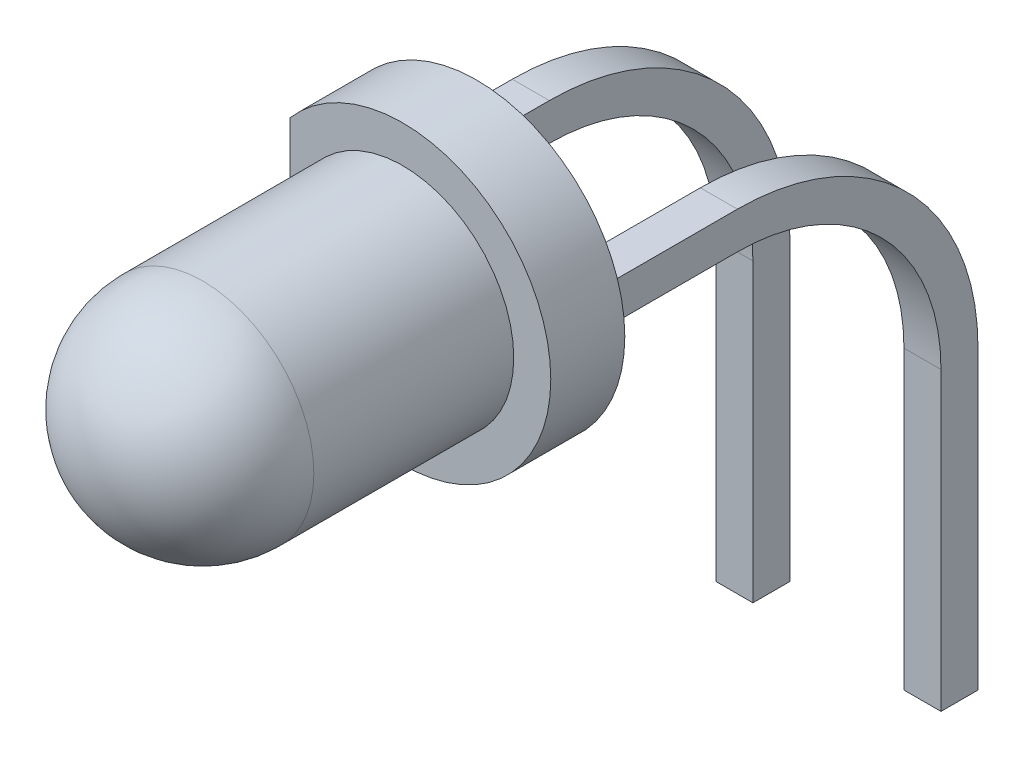
ISO-10303-21;
HEADER;
FILE_DESCRIPTION(('STEP AP214'),'2;1');
FILE_NAME('part.step','',(''),(''),'','','');
FILE_SCHEMA(('AUTOMOTIVE_DESIGN { 1 0 10303 214 1 1 1 1 }'));
ENDSEC;
DATA;
#1=APPLICATION_CONTEXT('core data for automotive mechanical design processes');
#2=APPLICATION_PROTOCOL_DEFINITION('international standard','automotive_design',2000,#1);
#3=PRODUCT_CONTEXT('',#1,'mechanical');
#4=PRODUCT('Part','Part','',(#3));
#5=PRODUCT_RELATED_PRODUCT_CATEGORY('part','',(#4));
#6=PRODUCT_DEFINITION_FORMATION('','',#4);
#7=PRODUCT_DEFINITION_CONTEXT('part definition',#1,'design');
#8=PRODUCT_DEFINITION('design','',#6,#7);
#9=PRODUCT_DEFINITION_SHAPE('','',#8);
#10=(LENGTH_UNIT() NAMED_UNIT(*) SI_UNIT(.MILLI.,.METRE.));
#11=(NAMED_UNIT(*) PLANE_ANGLE_UNIT() SI_UNIT($,.RADIAN.));
#12=(NAMED_UNIT(*) SI_UNIT($,.STERADIAN.) SOLID_ANGLE_UNIT());
#13=UNCERTAINTY_MEASURE_WITH_UNIT(LENGTH_MEASURE(1.E-05),#10,'distance_accuracy_value','');
#14=(GEOMETRIC_REPRESENTATION_CONTEXT(3) GLOBAL_UNCERTAINTY_ASSIGNED_CONTEXT((#13)) GLOBAL_UNIT_ASSIGNED_CONTEXT((#10,
#11,#12)) REPRESENTATION_CONTEXT('',''));
#15=CARTESIAN_POINT('',(0.,0.,0.));
#16=DIRECTION('',(0.,0.,1.));
#17=DIRECTION('',(1.,0.,0.));
#18=AXIS2_PLACEMENT_3D('',#15,#16,#17);
#19=CARTESIAN_POINT('',(-1.52000000000002,0.,-0.249999999999991));
#20=DIRECTION('',(0.,0.,1.));
#21=DIRECTION('',(1.,0.,0.));
#22=AXIS2_PLACEMENT_3D('',#19,#20,#21);
#23=PLANE('',#22);
#24=DIRECTION('',(-1.,0.,0.));
#25=VECTOR('',#24,1.);
#26=CARTESIAN_POINT('',(-1.52000000000002,0.,-0.249999999999991));
#27=LINE('',#26,#25);
#28=CARTESIAN_POINT('',(-1.02000000000002,0.,-0.249999999999994));
#29=VERTEX_POINT('',#28);
#30=CARTESIAN_POINT('',(-1.52000000000002,0.,-0.249999999999991));
#31=VERTEX_POINT('',#30);
#32=EDGE_CURVE('E121',#29,#31,#27,.T.);
#33=ORIENTED_EDGE('',*,*,#32,.F.);
#34=DIRECTION('',(0.,-1.,0.));
#35=VECTOR('',#34,1.);
#36=CARTESIAN_POINT('',(-1.02000000000002,0.,-0.249999999999994));
#37=LINE('',#36,#35);
#38=CARTESIAN_POINT('',(-1.02000000000002,-4.,-0.249999999999995));
#39=VERTEX_POINT('',#38);
#40=EDGE_CURVE('E51',#29,#39,#37,.T.);
#41=ORIENTED_EDGE('',*,*,#40,.T.);
#42=DIRECTION('',(-1.,0.,0.));
#43=VECTOR('',#42,1.);
#44=CARTESIAN_POINT('',(-1.52000000000002,-4.,-0.249999999999991));
#45=LINE('',#44,#43);
#46=CARTESIAN_POINT('',(-1.52000000000002,-4.,-0.249999999999991));
#47=VERTEX_POINT('',#46);
#48=EDGE_CURVE('E58',#39,#47,#45,.T.);
#49=ORIENTED_EDGE('',*,*,#48,.T.);
#50=DIRECTION('',(0.,-1.,0.));
#51=VECTOR('',#50,1.);
#52=CARTESIAN_POINT('',(-1.52000000000002,0.,-0.249999999999991));
#53=LINE('',#52,#51);
#54=EDGE_CURVE('E12',#31,#47,#53,.T.);
#55=ORIENTED_EDGE('',*,*,#54,.F.);
#56=EDGE_LOOP('',(#33,#41,#49,#55));
#57=FACE_BOUND('',#56,.T.);
#58=ADVANCED_FACE('F44',(#57),#23,.F.);
#59=CARTESIAN_POINT('',(-1.52000000000002,0.,0.250000000000009));
#60=DIRECTION('',(0.,0.,-1.));
#61=DIRECTION('',(-1.,0.,0.));
#62=AXIS2_PLACEMENT_3D('',#59,#60,#61);
#63=PLANE('',#62);
#64=DIRECTION('',(1.,0.,0.));
#65=VECTOR('',#64,1.);
#66=CARTESIAN_POINT('',(-1.52000000000002,0.,0.250000000000009));
#67=LINE('',#66,#65);
#68=CARTESIAN_POINT('',(-1.52000000000002,0.,0.250000000000009));
#69=VERTEX_POINT('',#68);
#70=CARTESIAN_POINT('',(-1.02000000000002,0.,0.250000000000006));
#71=VERTEX_POINT('',#70);
#72=EDGE_CURVE('E144',#69,#71,#67,.T.);
#73=ORIENTED_EDGE('',*,*,#72,.F.);
#74=DIRECTION('',(0.,-1.,0.));
#75=VECTOR('',#74,1.);
#76=CARTESIAN_POINT('',(-1.52000000000002,0.,0.250000000000009));
#77=LINE('',#76,#75);
#78=CARTESIAN_POINT('',(-1.52000000000002,-4.,0.250000000000009));
#79=VERTEX_POINT('',#78);
#80=EDGE_CURVE('E116',#69,#79,#77,.T.);
#81=ORIENTED_EDGE('',*,*,#80,.T.);
#82=DIRECTION('',(1.,0.,0.));
#83=VECTOR('',#82,1.);
#84=CARTESIAN_POINT('',(-1.52000000000002,-4.,0.250000000000009));
#85=LINE('',#84,#83);
#86=CARTESIAN_POINT('',(-1.02000000000002,-4.,0.250000000000005));
#87=VERTEX_POINT('',#86);
#88=EDGE_CURVE('E158',#79,#87,#85,.T.);
#89=ORIENTED_EDGE('',*,*,#88,.T.);
#90=DIRECTION('',(0.,-1.,0.));
#91=VECTOR('',#90,1.);
#92=CARTESIAN_POINT('',(-1.02000000000002,0.,0.250000000000006));
#93=LINE('',#92,#91);
#94=EDGE_CURVE('E163',#71,#87,#93,.T.);
#95=ORIENTED_EDGE('',*,*,#94,.F.);
#96=EDGE_LOOP('',(#73,#81,#89,#95));
#97=FACE_BOUND('',#96,.T.);
#98=ADVANCED_FACE('F190',(#97),#63,.F.);
#99=CARTESIAN_POINT('',(0.,0.,3.));
#100=DIRECTION('',(-1.,0.,0.));
#101=DIRECTION('',(0.,0.,1.));
#102=AXIS2_PLACEMENT_3D('',#99,#100,#101);
#103=CYLINDRICAL_SURFACE('',#102,3.24999999999999);
#104=DIRECTION('',(-1.,0.,0.));
#105=VECTOR('',#104,1.);
#106=CARTESIAN_POINT('',(-1.52000000000002,3.24999999999999,3.));
#107=LINE('',#106,#105);
#108=CARTESIAN_POINT('',(-1.02000000000002,3.24999999999999,3.));
#109=VERTEX_POINT('',#108);
#110=CARTESIAN_POINT('',(-1.52000000000002,3.24999999999999,3.));
#111=VERTEX_POINT('',#110);
#112=EDGE_CURVE('E129',#109,#111,#107,.T.);
#113=ORIENTED_EDGE('',*,*,#112,.F.);
#114=CARTESIAN_POINT('',(-1.02000000000002,0.,3.));
#115=DIRECTION('',(-1.,0.,0.));
#116=DIRECTION('',(0.,0.,1.));
#117=AXIS2_PLACEMENT_3D('',#114,#115,#116);
#118=CIRCLE('',#117,3.24999999999999);
#119=EDGE_CURVE('E150',#109,#29,#118,.T.);
#120=ORIENTED_EDGE('',*,*,#119,.T.);
#121=ORIENTED_EDGE('',*,*,#32,.T.);
#122=CARTESIAN_POINT('',(-1.52000000000002,0.,3.));
#123=DIRECTION('',(-1.,0.,0.));
#124=DIRECTION('',(0.,0.,1.));
#125=AXIS2_PLACEMENT_3D('',#122,#123,#124);
#126=CIRCLE('',#125,3.24999999999999);
#127=EDGE_CURVE('E153',#111,#31,#126,.T.);
#128=ORIENTED_EDGE('',*,*,#127,.F.);
#129=EDGE_LOOP('',(#113,#120,#121,#128));
#130=FACE_BOUND('',#129,.T.);
#131=ADVANCED_FACE('F171',(#130),#103,.T.);
#132=CARTESIAN_POINT('',(0.,0.,3.));
#133=DIRECTION('',(-1.,0.,0.));
#134=DIRECTION('',(0.,0.,1.));
#135=AXIS2_PLACEMENT_3D('',#132,#133,#134);
#136=CYLINDRICAL_SURFACE('',#135,2.74999999999999);
#137=DIRECTION('',(1.,0.,0.));
#138=VECTOR('',#137,1.);
#139=CARTESIAN_POINT('',(-1.52000000000002,2.74999999999999,3.));
#140=LINE('',#139,#138);
#141=CARTESIAN_POINT('',(-1.52000000000002,2.74999999999999,3.));
#142=VERTEX_POINT('',#141);
#143=CARTESIAN_POINT('',(-1.02000000000002,2.74999999999999,3.));
#144=VERTEX_POINT('',#143);
#145=EDGE_CURVE('E124',#142,#144,#140,.T.);
#146=ORIENTED_EDGE('',*,*,#145,.F.);
#147=CARTESIAN_POINT('',(-1.52000000000002,0.,3.));
#148=DIRECTION('',(-1.,0.,0.));
#149=DIRECTION('',(0.,0.,1.));
#150=AXIS2_PLACEMENT_3D('',#147,#148,#149);
#151=CIRCLE('',#150,2.74999999999999);
#152=EDGE_CURVE('E108',#142,#69,#151,.T.);
#153=ORIENTED_EDGE('',*,*,#152,.T.);
#154=ORIENTED_EDGE('',*,*,#72,.T.);
#155=CARTESIAN_POINT('',(-1.02000000000002,0.,3.));
#156=DIRECTION('',(-1.,0.,0.));
#157=DIRECTION('',(0.,0.,1.));
#158=AXIS2_PLACEMENT_3D('',#155,#156,#157);
#159=CIRCLE('',#158,2.74999999999999);
#160=EDGE_CURVE('E120',#144,#71,#159,.T.);
#161=ORIENTED_EDGE('',*,*,#160,.F.);
#162=EDGE_LOOP('',(#146,#153,#154,#161));
#163=FACE_BOUND('',#162,.T.);
#164=ADVANCED_FACE('F125',(#163),#136,.F.);
#165=CARTESIAN_POINT('',(-1.52000000000002,2.74999999999999,3.));
#166=DIRECTION('',(-1.,0.,0.));
#167=DIRECTION('',(0.,-1.,0.));
#168=AXIS2_PLACEMENT_3D('',#165,#166,#167);
#169=PLANE('',#168);
#170=DIRECTION('',(0.,-1.,0.));
#171=VECTOR('',#170,1.);
#172=CARTESIAN_POINT('',(-1.52000000000002,2.74999999999999,5.));
#173=LINE('',#172,#171);
#174=CARTESIAN_POINT('',(-1.52000000000002,3.24999999999999,5.));
#175=VERTEX_POINT('',#174);
#176=CARTESIAN_POINT('',(-1.52000000000002,2.74999999999999,5.));
#177=VERTEX_POINT('',#176);
#178=EDGE_CURVE('E183',#175,#177,#173,.T.);
#179=ORIENTED_EDGE('',*,*,#178,.F.);
#180=DIRECTION('',(0.,0.,1.));
#181=VECTOR('',#180,1.);
#182=CARTESIAN_POINT('',(-1.52000000000002,3.24999999999999,3.));
#183=LINE('',#182,#181);
#184=EDGE_CURVE('E146',#111,#175,#183,.T.);
#185=ORIENTED_EDGE('',*,*,#184,.F.);
#186=ORIENTED_EDGE('',*,*,#127,.T.);
#187=ORIENTED_EDGE('',*,*,#54,.T.);
#188=DIRECTION('',(0.,0.,1.));
#189=VECTOR('',#188,1.);
#190=CARTESIAN_POINT('',(-1.52000000000002,-4.,0.250000000000009));
#191=LINE('',#190,#189);
#192=EDGE_CURVE('E156',#47,#79,#191,.T.);
#193=ORIENTED_EDGE('',*,*,#192,.T.);
#194=ORIENTED_EDGE('',*,*,#80,.F.);
#195=ORIENTED_EDGE('',*,*,#152,.F.);
#196=DIRECTION('',(0.,0.,1.));
#197=VECTOR('',#196,1.);
#198=CARTESIAN_POINT('',(-1.52000000000002,2.74999999999999,3.));
#199=LINE('',#198,#197);
#200=EDGE_CURVE('E113',#142,#177,#199,.T.);
#201=ORIENTED_EDGE('',*,*,#200,.T.);
#202=EDGE_LOOP('',(#179,#185,#186,#187,#193,#194,#195,#201));
#203=FACE_BOUND('',#202,.T.);
#204=ADVANCED_FACE('F111',(#203),#169,.T.);
#205=CARTESIAN_POINT('',(-1.52000000000002,3.24999999999999,3.));
#206=DIRECTION('',(0.,1.,0.));
#207=DIRECTION('',(-1.,0.,0.));
#208=AXIS2_PLACEMENT_3D('',#205,#206,#207);
#209=PLANE('',#208);
#210=DIRECTION('',(-1.,0.,0.));
#211=VECTOR('',#210,1.);
#212=CARTESIAN_POINT('',(-1.52000000000002,3.24999999999999,5.));
#213=LINE('',#212,#211);
#214=CARTESIAN_POINT('',(-1.02000000000002,3.24999999999999,5.));
#215=VERTEX_POINT('',#214);
#216=EDGE_CURVE('E130',#215,#175,#213,.T.);
#217=ORIENTED_EDGE('',*,*,#216,.F.);
#218=DIRECTION('',(0.,0.,1.));
#219=VECTOR('',#218,1.);
#220=CARTESIAN_POINT('',(-1.02000000000002,3.24999999999999,3.));
#221=LINE('',#220,#219);
#222=EDGE_CURVE('E138',#109,#215,#221,.T.);
#223=ORIENTED_EDGE('',*,*,#222,.F.);
#224=ORIENTED_EDGE('',*,*,#112,.T.);
#225=ORIENTED_EDGE('',*,*,#184,.T.);
#226=EDGE_LOOP('',(#217,#223,#224,#225));
#227=FACE_BOUND('',#226,.T.);
#228=ADVANCED_FACE('F175',(#227),#209,.T.);
#229=CARTESIAN_POINT('',(-1.02000000000002,2.74999999999999,3.));
#230=DIRECTION('',(1.,0.,0.));
#231=DIRECTION('',(0.,1.,0.));
#232=AXIS2_PLACEMENT_3D('',#229,#230,#231);
#233=PLANE('',#232);
#234=DIRECTION('',(0.,1.,0.));
#235=VECTOR('',#234,1.);
#236=CARTESIAN_POINT('',(-1.02000000000002,2.74999999999999,5.));
#237=LINE('',#236,#235);
#238=CARTESIAN_POINT('',(-1.02000000000002,2.74999999999999,5.));
#239=VERTEX_POINT('',#238);
#240=EDGE_CURVE('E180',#239,#215,#237,.T.);
#241=ORIENTED_EDGE('',*,*,#240,.F.);
#242=DIRECTION('',(0.,0.,1.));
#243=VECTOR('',#242,1.);
#244=CARTESIAN_POINT('',(-1.02000000000002,2.74999999999999,3.));
#245=LINE('',#244,#243);
#246=EDGE_CURVE('E136',#144,#239,#245,.T.);
#247=ORIENTED_EDGE('',*,*,#246,.F.);
#248=ORIENTED_EDGE('',*,*,#160,.T.);
#249=ORIENTED_EDGE('',*,*,#94,.T.);
#250=DIRECTION('',(0.,0.,-1.));
#251=VECTOR('',#250,1.);
#252=CARTESIAN_POINT('',(-1.02000000000002,-4.,0.250000000000005));
#253=LINE('',#252,#251);
#254=EDGE_CURVE('E66',#87,#39,#253,.T.);
#255=ORIENTED_EDGE('',*,*,#254,.T.);
#256=ORIENTED_EDGE('',*,*,#40,.F.);
#257=ORIENTED_EDGE('',*,*,#119,.F.);
#258=ORIENTED_EDGE('',*,*,#222,.T.);
#259=EDGE_LOOP('',(#241,#247,#248,#249,#255,#256,#257,#258));
#260=FACE_BOUND('',#259,.T.);
#261=ADVANCED_FACE('F166',(#260),#233,.T.);
#262=CARTESIAN_POINT('',(-1.52000000000002,2.74999999999999,3.));
#263=DIRECTION('',(0.,-1.,0.));
#264=DIRECTION('',(1.,0.,0.));
#265=AXIS2_PLACEMENT_3D('',#262,#263,#264);
#266=PLANE('',#265);
#267=DIRECTION('',(1.,0.,0.));
#268=VECTOR('',#267,1.);
#269=CARTESIAN_POINT('',(-1.52000000000002,2.74999999999999,5.));
#270=LINE('',#269,#268);
#271=EDGE_CURVE('E134',#177,#239,#270,.T.);
#272=ORIENTED_EDGE('',*,*,#271,.F.);
#273=ORIENTED_EDGE('',*,*,#200,.F.);
#274=ORIENTED_EDGE('',*,*,#145,.T.);
#275=ORIENTED_EDGE('',*,*,#246,.T.);
#276=EDGE_LOOP('',(#272,#273,#274,#275));
#277=FACE_BOUND('',#276,.T.);
#278=ADVANCED_FACE('F132',(#277),#266,.T.);
#279=CARTESIAN_POINT('',(-1.52000000000002,-4.,-0.249999999999991));
#280=DIRECTION('',(0.,-1.,0.));
#281=DIRECTION('',(-1.,0.,0.));
#282=AXIS2_PLACEMENT_3D('',#279,#280,#281);
#283=PLANE('',#282);
#284=ORIENTED_EDGE('',*,*,#192,.F.);
#285=ORIENTED_EDGE('',*,*,#48,.F.);
#286=ORIENTED_EDGE('',*,*,#254,.F.);
#287=ORIENTED_EDGE('',*,*,#88,.F.);
#288=EDGE_LOOP('',(#284,#285,#286,#287));
#289=FACE_BOUND('',#288,.T.);
#290=ADVANCED_FACE('F188',(#289),#283,.T.);
#291=CARTESIAN_POINT('',(-1.52000000000002,3.24999999999999,5.));
#292=DIRECTION('',(0.,0.,-1.));
#293=DIRECTION('',(-1.,0.,0.));
#294=AXIS2_PLACEMENT_3D('',#291,#292,#293);
#295=PLANE('',#294);
#296=ORIENTED_EDGE('',*,*,#178,.T.);
#297=ORIENTED_EDGE('',*,*,#271,.T.);
#298=ORIENTED_EDGE('',*,*,#240,.T.);
#299=ORIENTED_EDGE('',*,*,#216,.T.);
#300=EDGE_LOOP('',(#296,#297,#298,#299));
#301=FACE_BOUND('',#300,.T.);
#302=ADVANCED_FACE('F185',(#301),#295,.F.);
#303=CLOSED_SHELL('',(#58,#98,#131,#164,#204,#228,#261,#278,#290,#302));
#304=MANIFOLD_SOLID_BREP('B2',#303);
#305=CARTESIAN_POINT('',(1.52,0.,-0.250000000000001));
#306=DIRECTION('',(0.,0.,1.));
#307=DIRECTION('',(0.,-1.,0.));
#308=AXIS2_PLACEMENT_3D('',#305,#306,#307);
#309=PLANE('',#308);
#310=DIRECTION('',(-1.,0.,0.));
#311=VECTOR('',#310,1.);
#312=CARTESIAN_POINT('',(1.52,0.,-0.250000000000001));
#313=LINE('',#312,#311);
#314=CARTESIAN_POINT('',(1.52,0.,-0.250000000000001));
#315=VERTEX_POINT('',#314);
#316=CARTESIAN_POINT('',(1.02,0.,-0.250000000000001));
#317=VERTEX_POINT('',#316);
#318=EDGE_CURVE('E370',#315,#317,#313,.T.);
#319=ORIENTED_EDGE('',*,*,#318,.F.);
#320=DIRECTION('',(0.,-1.,0.));
#321=VECTOR('',#320,1.);
#322=CARTESIAN_POINT('',(1.52,0.,-0.250000000000001));
#323=LINE('',#322,#321);
#324=CARTESIAN_POINT('',(1.52,-4.,-0.250000000000002));
#325=VERTEX_POINT('',#324);
#326=EDGE_CURVE('E300',#315,#325,#323,.T.);
#327=ORIENTED_EDGE('',*,*,#326,.T.);
#328=DIRECTION('',(-1.,0.,0.));
#329=VECTOR('',#328,1.);
#330=CARTESIAN_POINT('',(1.52,-4.,-0.250000000000002));
#331=LINE('',#330,#329);
#332=CARTESIAN_POINT('',(1.02,-4.,-0.250000000000002));
#333=VERTEX_POINT('',#332);
#334=EDGE_CURVE('E307',#325,#333,#331,.T.);
#335=ORIENTED_EDGE('',*,*,#334,.T.);
#336=DIRECTION('',(0.,-1.,0.));
#337=VECTOR('',#336,1.);
#338=CARTESIAN_POINT('',(1.02,0.,-0.250000000000001));
#339=LINE('',#338,#337);
#340=EDGE_CURVE('E42',#317,#333,#339,.T.);
#341=ORIENTED_EDGE('',*,*,#340,.F.);
#342=EDGE_LOOP('',(#319,#327,#335,#341));
#343=FACE_BOUND('',#342,.T.);
#344=ADVANCED_FACE('F293',(#343),#309,.F.);
#345=CARTESIAN_POINT('',(1.52,0.,0.249999999999999));
#346=DIRECTION('',(0.,0.,-1.));
#347=DIRECTION('',(0.,1.,0.));
#348=AXIS2_PLACEMENT_3D('',#345,#346,#347);
#349=PLANE('',#348);
#350=DIRECTION('',(1.,0.,0.));
#351=VECTOR('',#350,1.);
#352=CARTESIAN_POINT('',(1.52,0.,0.249999999999999));
#353=LINE('',#352,#351);
#354=CARTESIAN_POINT('',(1.02,0.,0.249999999999999));
#355=VERTEX_POINT('',#354);
#356=CARTESIAN_POINT('',(1.52,0.,0.249999999999999));
#357=VERTEX_POINT('',#356);
#358=EDGE_CURVE('E393',#355,#357,#353,.T.);
#359=ORIENTED_EDGE('',*,*,#358,.F.);
#360=DIRECTION('',(0.,-1.,0.));
#361=VECTOR('',#360,1.);
#362=CARTESIAN_POINT('',(1.02,0.,0.249999999999999));
#363=LINE('',#362,#361);
#364=CARTESIAN_POINT('',(1.02,-4.,0.249999999999998));
#365=VERTEX_POINT('',#364);
#366=EDGE_CURVE('E365',#355,#365,#363,.T.);
#367=ORIENTED_EDGE('',*,*,#366,.T.);
#368=DIRECTION('',(1.,0.,0.));
#369=VECTOR('',#368,1.);
#370=CARTESIAN_POINT('',(1.52,-4.,0.249999999999998));
#371=LINE('',#370,#369);
#372=CARTESIAN_POINT('',(1.52,-4.,0.249999999999998));
#373=VERTEX_POINT('',#372);
#374=EDGE_CURVE('E407',#365,#373,#371,.T.);
#375=ORIENTED_EDGE('',*,*,#374,.T.);
#376=DIRECTION('',(0.,-1.,0.));
#377=VECTOR('',#376,1.);
#378=CARTESIAN_POINT('',(1.52,0.,0.249999999999999));
#379=LINE('',#378,#377);
#380=EDGE_CURVE('E412',#357,#373,#379,.T.);
#381=ORIENTED_EDGE('',*,*,#380,.F.);
#382=EDGE_LOOP('',(#359,#367,#375,#381));
#383=FACE_BOUND('',#382,.T.);
#384=ADVANCED_FACE('F439',(#383),#349,.F.);
#385=CARTESIAN_POINT('',(0.,0.,3.));
#386=DIRECTION('',(-1.,0.,0.));
#387=DIRECTION('',(0.,0.,1.));
#388=AXIS2_PLACEMENT_3D('',#385,#386,#387);
#389=CYLINDRICAL_SURFACE('',#388,3.25);
#390=DIRECTION('',(-1.,0.,0.));
#391=VECTOR('',#390,1.);
#392=CARTESIAN_POINT('',(1.52,3.25,3.));
#393=LINE('',#392,#391);
#394=CARTESIAN_POINT('',(1.52,3.25,3.));
#395=VERTEX_POINT('',#394);
#396=CARTESIAN_POINT('',(1.02,3.25,3.));
#397=VERTEX_POINT('',#396);
#398=EDGE_CURVE('E378',#395,#397,#393,.T.);
#399=ORIENTED_EDGE('',*,*,#398,.F.);
#400=CARTESIAN_POINT('',(1.52,0.,3.));
#401=DIRECTION('',(-1.,0.,0.));
#402=DIRECTION('',(0.,0.,1.));
#403=AXIS2_PLACEMENT_3D('',#400,#401,#402);
#404=CIRCLE('',#403,3.25);
#405=EDGE_CURVE('E399',#395,#315,#404,.T.);
#406=ORIENTED_EDGE('',*,*,#405,.T.);
#407=ORIENTED_EDGE('',*,*,#318,.T.);
#408=CARTESIAN_POINT('',(1.02,0.,3.));
#409=DIRECTION('',(-1.,0.,0.));
#410=DIRECTION('',(0.,0.,1.));
#411=AXIS2_PLACEMENT_3D('',#408,#409,#410);
#412=CIRCLE('',#411,3.25);
#413=EDGE_CURVE('E402',#397,#317,#412,.T.);
#414=ORIENTED_EDGE('',*,*,#413,.F.);
#415=EDGE_LOOP('',(#399,#406,#407,#414));
#416=FACE_BOUND('',#415,.T.);
#417=ADVANCED_FACE('F420',(#416),#389,.T.);
#418=CARTESIAN_POINT('',(0.,0.,3.));
#419=DIRECTION('',(-1.,0.,0.));
#420=DIRECTION('',(0.,0.,1.));
#421=AXIS2_PLACEMENT_3D('',#418,#419,#420);
#422=CYLINDRICAL_SURFACE('',#421,2.75);
#423=DIRECTION('',(1.,0.,0.));
#424=VECTOR('',#423,1.);
#425=CARTESIAN_POINT('',(1.52,2.75,3.));
#426=LINE('',#425,#424);
#427=CARTESIAN_POINT('',(1.02,2.75,3.));
#428=VERTEX_POINT('',#427);
#429=CARTESIAN_POINT('',(1.52,2.75,3.));
#430=VERTEX_POINT('',#429);
#431=EDGE_CURVE('E373',#428,#430,#426,.T.);
#432=ORIENTED_EDGE('',*,*,#431,.F.);
#433=CARTESIAN_POINT('',(1.02,0.,3.));
#434=DIRECTION('',(-1.,0.,0.));
#435=DIRECTION('',(0.,0.,1.));
#436=AXIS2_PLACEMENT_3D('',#433,#434,#435);
#437=CIRCLE('',#436,2.75);
#438=EDGE_CURVE('E357',#428,#355,#437,.T.);
#439=ORIENTED_EDGE('',*,*,#438,.T.);
#440=ORIENTED_EDGE('',*,*,#358,.T.);
#441=CARTESIAN_POINT('',(1.52,0.,3.));
#442=DIRECTION('',(-1.,0.,0.));
#443=DIRECTION('',(0.,0.,1.));
#444=AXIS2_PLACEMENT_3D('',#441,#442,#443);
#445=CIRCLE('',#444,2.75);
#446=EDGE_CURVE('E369',#430,#357,#445,.T.);
#447=ORIENTED_EDGE('',*,*,#446,.F.);
#448=EDGE_LOOP('',(#432,#439,#440,#447));
#449=FACE_BOUND('',#448,.T.);
#450=ADVANCED_FACE('F374',(#449),#422,.F.);
#451=CARTESIAN_POINT('',(1.02,2.75,3.));
#452=DIRECTION('',(-1.,0.,0.));
#453=DIRECTION('',(0.,0.,1.));
#454=AXIS2_PLACEMENT_3D('',#451,#452,#453);
#455=PLANE('',#454);
#456=DIRECTION('',(0.,-1.,0.));
#457=VECTOR('',#456,1.);
#458=CARTESIAN_POINT('',(1.02,2.75,5.));
#459=LINE('',#458,#457);
#460=CARTESIAN_POINT('',(1.02,3.25,5.));
#461=VERTEX_POINT('',#460);
#462=CARTESIAN_POINT('',(1.02,2.75,5.));
#463=VERTEX_POINT('',#462);
#464=EDGE_CURVE('E432',#461,#463,#459,.T.);
#465=ORIENTED_EDGE('',*,*,#464,.F.);
#466=DIRECTION('',(0.,0.,1.));
#467=VECTOR('',#466,1.);
#468=CARTESIAN_POINT('',(1.02,3.25,3.));
#469=LINE('',#468,#467);
#470=EDGE_CURVE('E395',#397,#461,#469,.T.);
#471=ORIENTED_EDGE('',*,*,#470,.F.);
#472=ORIENTED_EDGE('',*,*,#413,.T.);
#473=ORIENTED_EDGE('',*,*,#340,.T.);
#474=DIRECTION('',(0.,0.,1.));
#475=VECTOR('',#474,1.);
#476=CARTESIAN_POINT('',(1.02,-4.,0.249999999999998));
#477=LINE('',#476,#475);
#478=EDGE_CURVE('E405',#333,#365,#477,.T.);
#479=ORIENTED_EDGE('',*,*,#478,.T.);
#480=ORIENTED_EDGE('',*,*,#366,.F.);
#481=ORIENTED_EDGE('',*,*,#438,.F.);
#482=DIRECTION('',(0.,0.,1.));
#483=VECTOR('',#482,1.);
#484=CARTESIAN_POINT('',(1.02,2.75,3.));
#485=LINE('',#484,#483);
#486=EDGE_CURVE('E362',#428,#463,#485,.T.);
#487=ORIENTED_EDGE('',*,*,#486,.T.);
#488=EDGE_LOOP('',(#465,#471,#472,#473,#479,#480,#481,#487));
#489=FACE_BOUND('',#488,.T.);
#490=ADVANCED_FACE('F360',(#489),#455,.T.);
#491=CARTESIAN_POINT('',(1.52,3.25,3.));
#492=DIRECTION('',(0.,1.,0.));
#493=DIRECTION('',(0.,0.,1.));
#494=AXIS2_PLACEMENT_3D('',#491,#492,#493);
#495=PLANE('',#494);
#496=DIRECTION('',(-1.,0.,0.));
#497=VECTOR('',#496,1.);
#498=CARTESIAN_POINT('',(1.52,3.25,5.));
#499=LINE('',#498,#497);
#500=CARTESIAN_POINT('',(1.52,3.25,5.));
#501=VERTEX_POINT('',#500);
#502=EDGE_CURVE('E379',#501,#461,#499,.T.);
#503=ORIENTED_EDGE('',*,*,#502,.F.);
#504=DIRECTION('',(0.,0.,1.));
#505=VECTOR('',#504,1.);
#506=CARTESIAN_POINT('',(1.52,3.25,3.));
#507=LINE('',#506,#505);
#508=EDGE_CURVE('E387',#395,#501,#507,.T.);
#509=ORIENTED_EDGE('',*,*,#508,.F.);
#510=ORIENTED_EDGE('',*,*,#398,.T.);
#511=ORIENTED_EDGE('',*,*,#470,.T.);
#512=EDGE_LOOP('',(#503,#509,#510,#511));
#513=FACE_BOUND('',#512,.T.);
#514=ADVANCED_FACE('F424',(#513),#495,.T.);
#515=CARTESIAN_POINT('',(1.52,2.75,3.));
#516=DIRECTION('',(1.,0.,0.));
#517=DIRECTION('',(0.,0.,-1.));
#518=AXIS2_PLACEMENT_3D('',#515,#516,#517);
#519=PLANE('',#518);
#520=DIRECTION('',(0.,1.,0.));
#521=VECTOR('',#520,1.);
#522=CARTESIAN_POINT('',(1.52,2.75,5.));
#523=LINE('',#522,#521);
#524=CARTESIAN_POINT('',(1.52,2.75,5.));
#525=VERTEX_POINT('',#524);
#526=EDGE_CURVE('E429',#525,#501,#523,.T.);
#527=ORIENTED_EDGE('',*,*,#526,.F.);
#528=DIRECTION('',(0.,0.,1.));
#529=VECTOR('',#528,1.);
#530=CARTESIAN_POINT('',(1.52,2.75,3.));
#531=LINE('',#530,#529);
#532=EDGE_CURVE('E385',#430,#525,#531,.T.);
#533=ORIENTED_EDGE('',*,*,#532,.F.);
#534=ORIENTED_EDGE('',*,*,#446,.T.);
#535=ORIENTED_EDGE('',*,*,#380,.T.);
#536=DIRECTION('',(0.,0.,-1.));
#537=VECTOR('',#536,1.);
#538=CARTESIAN_POINT('',(1.52,-4.,0.249999999999998));
#539=LINE('',#538,#537);
#540=EDGE_CURVE('E315',#373,#325,#539,.T.);
#541=ORIENTED_EDGE('',*,*,#540,.T.);
#542=ORIENTED_EDGE('',*,*,#326,.F.);
#543=ORIENTED_EDGE('',*,*,#405,.F.);
#544=ORIENTED_EDGE('',*,*,#508,.T.);
#545=EDGE_LOOP('',(#527,#533,#534,#535,#541,#542,#543,#544));
#546=FACE_BOUND('',#545,.T.);
#547=ADVANCED_FACE('F415',(#546),#519,.T.);
#548=CARTESIAN_POINT('',(1.52,2.75,3.));
#549=DIRECTION('',(0.,-1.,0.));
#550=DIRECTION('',(0.,0.,-1.));
#551=AXIS2_PLACEMENT_3D('',#548,#549,#550);
#552=PLANE('',#551);
#553=DIRECTION('',(1.,0.,0.));
#554=VECTOR('',#553,1.);
#555=CARTESIAN_POINT('',(1.52,2.75,5.));
#556=LINE('',#555,#554);
#557=EDGE_CURVE('E383',#463,#525,#556,.T.);
#558=ORIENTED_EDGE('',*,*,#557,.F.);
#559=ORIENTED_EDGE('',*,*,#486,.F.);
#560=ORIENTED_EDGE('',*,*,#431,.T.);
#561=ORIENTED_EDGE('',*,*,#532,.T.);
#562=EDGE_LOOP('',(#558,#559,#560,#561));
#563=FACE_BOUND('',#562,.T.);
#564=ADVANCED_FACE('F381',(#563),#552,.T.);
#565=CARTESIAN_POINT('',(1.02,-4.,-0.250000000000002));
#566=DIRECTION('',(0.,1.,0.));
#567=DIRECTION('',(1.,0.,0.));
#568=AXIS2_PLACEMENT_3D('',#565,#566,#567);
#569=PLANE('',#568);
#570=ORIENTED_EDGE('',*,*,#478,.F.);
#571=ORIENTED_EDGE('',*,*,#334,.F.);
#572=ORIENTED_EDGE('',*,*,#540,.F.);
#573=ORIENTED_EDGE('',*,*,#374,.F.);
#574=EDGE_LOOP('',(#570,#571,#572,#573));
#575=FACE_BOUND('',#574,.T.);
#576=ADVANCED_FACE('F437',(#575),#569,.F.);
#577=CARTESIAN_POINT('',(1.02,3.25,5.));
#578=DIRECTION('',(0.,0.,1.));
#579=DIRECTION('',(1.,0.,0.));
#580=AXIS2_PLACEMENT_3D('',#577,#578,#579);
#581=PLANE('',#580);
#582=ORIENTED_EDGE('',*,*,#464,.T.);
#583=ORIENTED_EDGE('',*,*,#557,.T.);
#584=ORIENTED_EDGE('',*,*,#526,.T.);
#585=ORIENTED_EDGE('',*,*,#502,.T.);
#586=EDGE_LOOP('',(#582,#583,#584,#585));
#587=FACE_BOUND('',#586,.T.);
#588=ADVANCED_FACE('F434',(#587),#581,.T.);
#589=CLOSED_SHELL('',(#344,#384,#417,#450,#490,#514,#547,#564,#576,#588));
#590=MANIFOLD_SOLID_BREP('B6',#589);
#591=CARTESIAN_POINT('',(0.,3.,6.));
#592=DIRECTION('',(0.,0.,1.));
#593=DIRECTION('',(1.,0.,0.));
#594=AXIS2_PLACEMENT_3D('',#591,#592,#593);
#595=PLANE('',#594);
#596=CARTESIAN_POINT('',(0.,3.,6.));
#597=DIRECTION('',(0.,0.,1.));
#598=DIRECTION('',(1.,0.,0.));
#599=AXIS2_PLACEMENT_3D('',#596,#597,#598);
#600=CIRCLE('',#599,2.);
#601=CARTESIAN_POINT('',(-1.52,1.70015385525825,6.));
#602=VERTEX_POINT('',#601);
#603=CARTESIAN_POINT('',(-1.52,4.29984614474175,6.));
#604=VERTEX_POINT('',#603);
#605=EDGE_CURVE('E564',#602,#604,#600,.T.);
#606=ORIENTED_EDGE('',*,*,#605,.T.);
#607=DIRECTION('',(0.,-1.,0.));
#608=VECTOR('',#607,1.);
#609=CARTESIAN_POINT('',(-1.52,4.29984614474175,6.));
#610=LINE('',#609,#608);
#611=EDGE_CURVE('E549',#604,#602,#610,.T.);
#612=ORIENTED_EDGE('',*,*,#611,.T.);
#613=EDGE_LOOP('',(#606,#612));
#614=FACE_BOUND('',#613,.T.);
#615=CARTESIAN_POINT('',(0.,3.,6.));
#616=DIRECTION('',(0.,0.,1.));
#617=DIRECTION('',(1.,0.,0.));
#618=AXIS2_PLACEMENT_3D('',#615,#616,#617);
#619=CIRCLE('',#618,1.5);
#620=CARTESIAN_POINT('',(1.5,3.,6.));
#621=VERTEX_POINT('',#620);
#622=EDGE_CURVE('E569',#621,#621,#619,.T.);
#623=ORIENTED_EDGE('',*,*,#622,.F.);
#624=EDGE_LOOP('',(#623));
#625=FACE_BOUND('',#624,.T.);
#626=ADVANCED_FACE('F533',(#614,#625),#595,.T.);
#627=CARTESIAN_POINT('',(0.,3.,6.));
#628=DIRECTION('',(0.,0.,-1.));
#629=DIRECTION('',(-1.,0.,0.));
#630=AXIS2_PLACEMENT_3D('',#627,#628,#629);
#631=CYLINDRICAL_SURFACE('',#630,2.);
#632=CARTESIAN_POINT('',(0.,3.,5.));
#633=DIRECTION('',(0.,0.,1.));
#634=DIRECTION('',(1.,0.,0.));
#635=AXIS2_PLACEMENT_3D('',#632,#633,#634);
#636=CIRCLE('',#635,2.);
#637=CARTESIAN_POINT('',(-1.52,1.70015385525825,5.));
#638=VERTEX_POINT('',#637);
#639=CARTESIAN_POINT('',(-1.52,4.29984614474175,5.));
#640=VERTEX_POINT('',#639);
#641=EDGE_CURVE('E565',#638,#640,#636,.T.);
#642=ORIENTED_EDGE('',*,*,#641,.T.);
#643=DIRECTION('',(0.,0.,-1.));
#644=VECTOR('',#643,1.);
#645=CARTESIAN_POINT('',(-1.52,4.29984614474175,6.));
#646=LINE('',#645,#644);
#647=EDGE_CURVE('E291',#604,#640,#646,.T.);
#648=ORIENTED_EDGE('',*,*,#647,.F.);
#649=ORIENTED_EDGE('',*,*,#605,.F.);
#650=DIRECTION('',(0.,0.,-1.));
#651=VECTOR('',#650,1.);
#652=CARTESIAN_POINT('',(-1.52,1.70015385525825,6.));
#653=LINE('',#652,#651);
#654=EDGE_CURVE('E542',#602,#638,#653,.T.);
#655=ORIENTED_EDGE('',*,*,#654,.T.);
#656=EDGE_LOOP('',(#642,#648,#649,#655));
#657=FACE_BOUND('',#656,.T.);
#658=ADVANCED_FACE('F535',(#657),#631,.T.);
#659=CARTESIAN_POINT('',(-1.52,4.29984614474175,6.));
#660=DIRECTION('',(1.,0.,0.));
#661=DIRECTION('',(0.,1.,0.));
#662=AXIS2_PLACEMENT_3D('',#659,#660,#661);
#663=PLANE('',#662);
#664=DIRECTION('',(0.,-1.,0.));
#665=VECTOR('',#664,1.);
#666=CARTESIAN_POINT('',(-1.52,4.29984614474175,5.));
#667=LINE('',#666,#665);
#668=EDGE_CURVE('E557',#640,#638,#667,.T.);
#669=ORIENTED_EDGE('',*,*,#668,.T.);
#670=ORIENTED_EDGE('',*,*,#654,.F.);
#671=ORIENTED_EDGE('',*,*,#611,.F.);
#672=ORIENTED_EDGE('',*,*,#647,.T.);
#673=EDGE_LOOP('',(#669,#670,#671,#672));
#674=FACE_BOUND('',#673,.T.);
#675=ADVANCED_FACE('F560',(#674),#663,.F.);
#676=CARTESIAN_POINT('',(0.,3.,5.));
#677=DIRECTION('',(0.,0.,1.));
#678=DIRECTION('',(1.,0.,0.));
#679=AXIS2_PLACEMENT_3D('',#676,#677,#678);
#680=PLANE('',#679);
#681=ORIENTED_EDGE('',*,*,#641,.F.);
#682=ORIENTED_EDGE('',*,*,#668,.F.);
#683=EDGE_LOOP('',(#681,#682));
#684=FACE_BOUND('',#683,.T.);
#685=ADVANCED_FACE('F568',(#684),#680,.F.);
#686=CARTESIAN_POINT('',(0.,3.,13.296819565402));
#687=DIRECTION('',(0.,0.,1.));
#688=DIRECTION('',(1.,0.,0.));
#689=AXIS2_PLACEMENT_3D('',#686,#687,#688);
#690=CYLINDRICAL_SURFACE('',#689,1.5);
#691=CARTESIAN_POINT('',(0.,3.,8.7));
#692=DIRECTION('',(0.,0.,1.));
#693=DIRECTION('',(1.,0.,0.));
#694=AXIS2_PLACEMENT_3D('',#691,#692,#693);
#695=CIRCLE('',#694,1.5);
#696=CARTESIAN_POINT('',(1.5,3.,8.7));
#697=VERTEX_POINT('',#696);
#698=EDGE_CURVE('E572',#697,#697,#695,.T.);
#699=ORIENTED_EDGE('',*,*,#698,.F.);
#700=EDGE_LOOP('',(#699));
#701=FACE_BOUND('',#700,.T.);
#702=ORIENTED_EDGE('',*,*,#622,.T.);
#703=EDGE_LOOP('',(#702));
#704=FACE_BOUND('',#703,.T.);
#705=ADVANCED_FACE('F582',(#701,#704),#690,.T.);
#706=CARTESIAN_POINT('',(0.,3.,8.7));
#707=DIRECTION('',(0.,0.,1.));
#708=DIRECTION('',(0.,1.,0.));
#709=AXIS2_PLACEMENT_3D('',#706,#707,#708);
#710=SPHERICAL_SURFACE('',#709,1.5);
#711=ORIENTED_EDGE('',*,*,#698,.T.);
#712=EDGE_LOOP('',(#711));
#713=FACE_BOUND('',#712,.T.);
#714=ADVANCED_FACE('F580',(#713),#710,.T.);
#715=CLOSED_SHELL('',(#626,#658,#675,#685,#705,#714));
#716=MANIFOLD_SOLID_BREP('B36',#715);
#717=ADVANCED_BREP_SHAPE_REPRESENTATION('',(#18,#304,#590,#716),#14);
#718=SHAPE_DEFINITION_REPRESENTATION(#9,#717);
ENDSEC;
END-ISO-10303-21;
